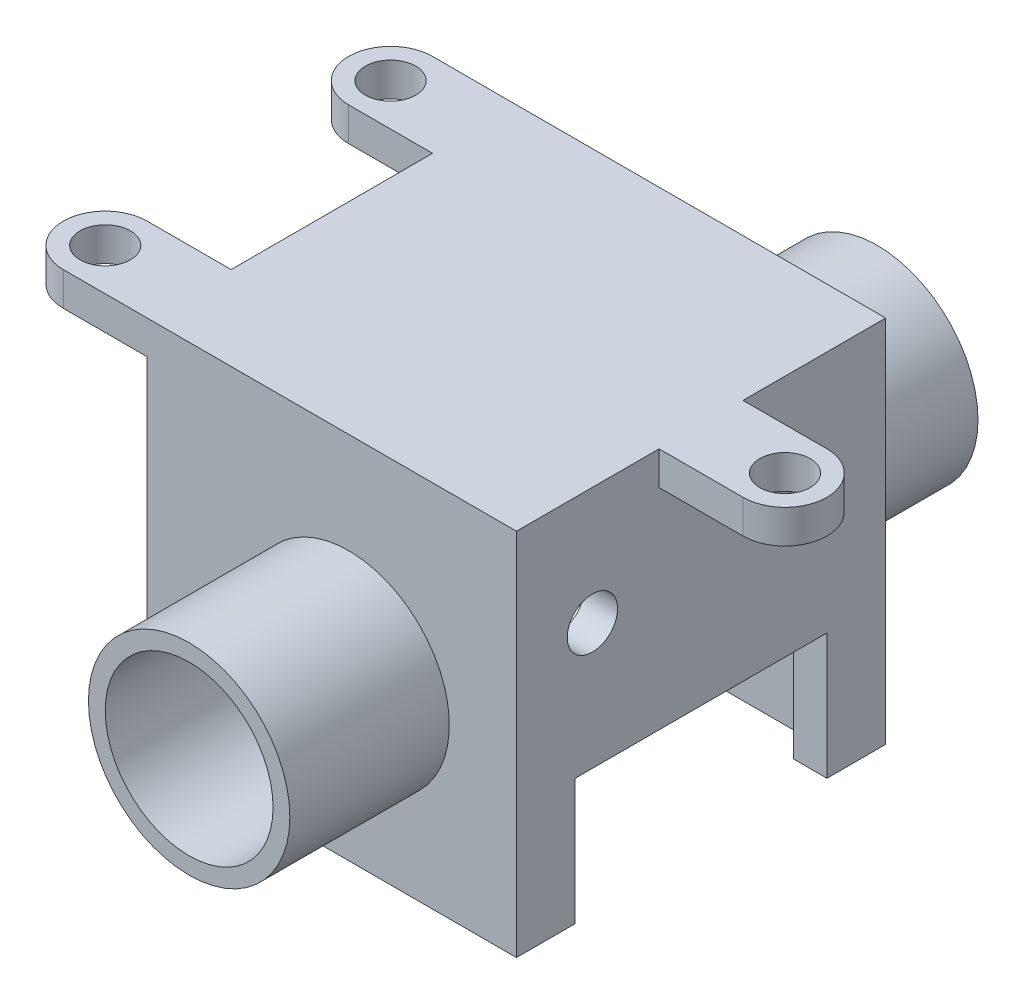
ISO-10303-21;
HEADER;
FILE_DESCRIPTION(('STEP AP214'),'2;1');
FILE_NAME('part.step','',(''),(''),'','','');
FILE_SCHEMA(('AUTOMOTIVE_DESIGN { 1 0 10303 214 1 1 1 1 }'));
ENDSEC;
DATA;
#1=APPLICATION_CONTEXT('core data for automotive mechanical design processes');
#2=APPLICATION_PROTOCOL_DEFINITION('international standard','automotive_design',2000,#1);
#3=PRODUCT_CONTEXT('',#1,'mechanical');
#4=PRODUCT('Part','Part','',(#3));
#5=PRODUCT_RELATED_PRODUCT_CATEGORY('part','',(#4));
#6=PRODUCT_DEFINITION_FORMATION('','',#4);
#7=PRODUCT_DEFINITION_CONTEXT('part definition',#1,'design');
#8=PRODUCT_DEFINITION('design','',#6,#7);
#9=PRODUCT_DEFINITION_SHAPE('','',#8);
#10=(LENGTH_UNIT() NAMED_UNIT(*) SI_UNIT(.MILLI.,.METRE.));
#11=(NAMED_UNIT(*) PLANE_ANGLE_UNIT() SI_UNIT($,.RADIAN.));
#12=(NAMED_UNIT(*) SI_UNIT($,.STERADIAN.) SOLID_ANGLE_UNIT());
#13=UNCERTAINTY_MEASURE_WITH_UNIT(LENGTH_MEASURE(1.E-05),#10,'distance_accuracy_value','');
#14=(GEOMETRIC_REPRESENTATION_CONTEXT(3) GLOBAL_UNCERTAINTY_ASSIGNED_CONTEXT((#13)) GLOBAL_UNIT_ASSIGNED_CONTEXT((#10,
#11,#12)) REPRESENTATION_CONTEXT('',''));
#15=CARTESIAN_POINT('',(0.,0.,0.));
#16=DIRECTION('',(0.,0.,1.));
#17=DIRECTION('',(1.,0.,0.));
#18=AXIS2_PLACEMENT_3D('',#15,#16,#17);
#19=CARTESIAN_POINT('',(-11.,10.,11.));
#20=DIRECTION('',(0.,0.,-1.));
#21=DIRECTION('',(-1.,0.,0.));
#22=AXIS2_PLACEMENT_3D('',#19,#20,#21);
#23=PLANE('',#22);
#24=DIRECTION('',(1.,0.,0.));
#25=VECTOR('',#24,1.);
#26=CARTESIAN_POINT('',(-11.,-10.,11.));
#27=LINE('',#26,#25);
#28=CARTESIAN_POINT('',(-11.,-10.,11.));
#29=VERTEX_POINT('',#28);
#30=CARTESIAN_POINT('',(11.,-10.,11.));
#31=VERTEX_POINT('',#30);
#32=EDGE_CURVE('E291',#29,#31,#27,.T.);
#33=ORIENTED_EDGE('',*,*,#32,.T.);
#34=DIRECTION('',(0.,-1.,0.));
#35=VECTOR('',#34,1.);
#36=CARTESIAN_POINT('',(11.,10.,11.));
#37=LINE('',#36,#35);
#38=CARTESIAN_POINT('',(11.,12.,11.));
#39=VERTEX_POINT('',#38);
#40=EDGE_CURVE('E293',#39,#31,#37,.T.);
#41=ORIENTED_EDGE('',*,*,#40,.F.);
#42=DIRECTION('',(1.,0.,0.));
#43=VECTOR('',#42,1.);
#44=CARTESIAN_POINT('',(-11.,12.,11.));
#45=LINE('',#44,#43);
#46=CARTESIAN_POINT('',(-16.,12.,11.));
#47=VERTEX_POINT('',#46);
#48=EDGE_CURVE('E374',#47,#39,#45,.T.);
#49=ORIENTED_EDGE('',*,*,#48,.F.);
#50=DIRECTION('',(0.,-1.,0.));
#51=VECTOR('',#50,1.);
#52=CARTESIAN_POINT('',(-16.,12.,11.));
#53=LINE('',#52,#51);
#54=CARTESIAN_POINT('',(-16.,10.,11.));
#55=VERTEX_POINT('',#54);
#56=EDGE_CURVE('E212',#47,#55,#53,.T.);
#57=ORIENTED_EDGE('',*,*,#56,.T.);
#58=DIRECTION('',(1.,0.,0.));
#59=VECTOR('',#58,1.);
#60=CARTESIAN_POINT('',(11.,10.,11.));
#61=LINE('',#60,#59);
#62=CARTESIAN_POINT('',(-11.,10.,11.));
#63=VERTEX_POINT('',#62);
#64=EDGE_CURVE('E401',#55,#63,#61,.T.);
#65=ORIENTED_EDGE('',*,*,#64,.T.);
#66=DIRECTION('',(0.,-1.,0.));
#67=VECTOR('',#66,1.);
#68=CARTESIAN_POINT('',(-11.,10.,11.));
#69=LINE('',#68,#67);
#70=EDGE_CURVE('E304',#63,#29,#69,.T.);
#71=ORIENTED_EDGE('',*,*,#70,.T.);
#72=EDGE_LOOP('',(#33,#41,#49,#57,#65,#71));
#73=FACE_BOUND('',#72,.T.);
#74=CARTESIAN_POINT('',(1.,0.,11.));
#75=DIRECTION('',(0.,0.,-1.));
#76=DIRECTION('',(-1.,0.,0.));
#77=AXIS2_PLACEMENT_3D('',#74,#75,#76);
#78=CIRCLE('',#77,6.);
#79=CARTESIAN_POINT('',(-5.,0.,11.));
#80=VERTEX_POINT('',#79);
#81=EDGE_CURVE('E11',#80,#80,#78,.F.);
#82=ORIENTED_EDGE('',*,*,#81,.F.);
#83=EDGE_LOOP('',(#82));
#84=FACE_BOUND('',#83,.T.);
#85=ADVANCED_FACE('F33',(#73,#84),#23,.F.);
#86=CARTESIAN_POINT('',(11.,10.,-11.));
#87=DIRECTION('',(-1.,0.,0.));
#88=DIRECTION('',(0.,0.,1.));
#89=AXIS2_PLACEMENT_3D('',#86,#87,#88);
#90=PLANE('',#89);
#91=CARTESIAN_POINT('',(11.,5.,6.475));
#92=DIRECTION('',(1.,0.,0.));
#93=DIRECTION('',(0.,0.,-1.));
#94=AXIS2_PLACEMENT_3D('',#91,#92,#93);
#95=CIRCLE('',#94,1.5);
#96=CARTESIAN_POINT('',(11.,5.,4.975));
#97=VERTEX_POINT('',#96);
#98=EDGE_CURVE('E236',#97,#97,#95,.T.);
#99=ORIENTED_EDGE('',*,*,#98,.F.);
#100=EDGE_LOOP('',(#99));
#101=FACE_BOUND('',#100,.T.);
#102=CARTESIAN_POINT('',(11.,5.,-6.475));
#103=DIRECTION('',(1.,0.,0.));
#104=DIRECTION('',(0.,0.,1.));
#105=AXIS2_PLACEMENT_3D('',#102,#103,#104);
#106=CIRCLE('',#105,1.5);
#107=CARTESIAN_POINT('',(11.,5.,-4.975));
#108=VERTEX_POINT('',#107);
#109=EDGE_CURVE('E253',#108,#108,#106,.T.);
#110=ORIENTED_EDGE('',*,*,#109,.F.);
#111=EDGE_LOOP('',(#110));
#112=FACE_BOUND('',#111,.T.);
#113=DIRECTION('',(0.,0.,-1.));
#114=VECTOR('',#113,1.);
#115=CARTESIAN_POINT('',(11.,-10.,-11.));
#116=LINE('',#115,#114);
#117=CARTESIAN_POINT('',(11.,-10.,7.5));
#118=VERTEX_POINT('',#117);
#119=EDGE_CURVE('E294',#31,#118,#116,.T.);
#120=ORIENTED_EDGE('',*,*,#119,.T.);
#121=DIRECTION('',(0.,-1.,0.));
#122=VECTOR('',#121,1.);
#123=CARTESIAN_POINT('',(11.,-10.,7.5));
#124=LINE('',#123,#122);
#125=CARTESIAN_POINT('',(11.,-2.5,7.5));
#126=VERTEX_POINT('',#125);
#127=EDGE_CURVE('E239',#126,#118,#124,.T.);
#128=ORIENTED_EDGE('',*,*,#127,.F.);
#129=DIRECTION('',(0.,0.,1.));
#130=VECTOR('',#129,1.);
#131=CARTESIAN_POINT('',(11.,-2.5,7.5));
#132=LINE('',#131,#130);
#133=CARTESIAN_POINT('',(11.,-2.5,-7.5));
#134=VERTEX_POINT('',#133);
#135=EDGE_CURVE('E235',#134,#126,#132,.T.);
#136=ORIENTED_EDGE('',*,*,#135,.F.);
#137=DIRECTION('',(0.,1.,0.));
#138=VECTOR('',#137,1.);
#139=CARTESIAN_POINT('',(11.,-10.,-7.5));
#140=LINE('',#139,#138);
#141=CARTESIAN_POINT('',(11.,-10.,-7.5));
#142=VERTEX_POINT('',#141);
#143=EDGE_CURVE('E232',#142,#134,#140,.T.);
#144=ORIENTED_EDGE('',*,*,#143,.F.);
#145=CARTESIAN_POINT('',(11.,-10.,-11.));
#146=VERTEX_POINT('',#145);
#147=EDGE_CURVE('E259',#142,#146,#116,.T.);
#148=ORIENTED_EDGE('',*,*,#147,.T.);
#149=DIRECTION('',(0.,-1.,0.));
#150=VECTOR('',#149,1.);
#151=CARTESIAN_POINT('',(11.,10.,-11.));
#152=LINE('',#151,#150);
#153=CARTESIAN_POINT('',(11.,12.,-11.));
#154=VERTEX_POINT('',#153);
#155=EDGE_CURVE('E310',#154,#146,#152,.T.);
#156=ORIENTED_EDGE('',*,*,#155,.F.);
#157=DIRECTION('',(0.,0.,-1.));
#158=VECTOR('',#157,1.);
#159=CARTESIAN_POINT('',(11.,12.,-11.));
#160=LINE('',#159,#158);
#161=CARTESIAN_POINT('',(11.,12.,-2.5));
#162=VERTEX_POINT('',#161);
#163=EDGE_CURVE('E386',#162,#154,#160,.T.);
#164=ORIENTED_EDGE('',*,*,#163,.F.);
#165=DIRECTION('',(0.,-1.,0.));
#166=VECTOR('',#165,1.);
#167=CARTESIAN_POINT('',(11.,12.,-2.5));
#168=LINE('',#167,#166);
#169=CARTESIAN_POINT('',(11.,10.,-2.5));
#170=VERTEX_POINT('',#169);
#171=EDGE_CURVE('E423',#162,#170,#168,.T.);
#172=ORIENTED_EDGE('',*,*,#171,.T.);
#173=DIRECTION('',(0.,0.,-1.));
#174=VECTOR('',#173,1.);
#175=CARTESIAN_POINT('',(11.,10.,-11.));
#176=LINE('',#175,#174);
#177=CARTESIAN_POINT('',(11.,10.,2.5));
#178=VERTEX_POINT('',#177);
#179=EDGE_CURVE('E289',#178,#170,#176,.T.);
#180=ORIENTED_EDGE('',*,*,#179,.F.);
#181=DIRECTION('',(0.,-1.,0.));
#182=VECTOR('',#181,1.);
#183=CARTESIAN_POINT('',(11.,12.,2.5));
#184=LINE('',#183,#182);
#185=CARTESIAN_POINT('',(11.,12.,2.5));
#186=VERTEX_POINT('',#185);
#187=EDGE_CURVE('E432',#186,#178,#184,.T.);
#188=ORIENTED_EDGE('',*,*,#187,.F.);
#189=DIRECTION('',(0.,0.,-1.));
#190=VECTOR('',#189,1.);
#191=CARTESIAN_POINT('',(11.,12.,2.5));
#192=LINE('',#191,#190);
#193=EDGE_CURVE('E368',#39,#186,#192,.T.);
#194=ORIENTED_EDGE('',*,*,#193,.F.);
#195=ORIENTED_EDGE('',*,*,#40,.T.);
#196=EDGE_LOOP('',(#120,#128,#136,#144,#148,#156,#164,#172,#180,#188,#194,#195));
#197=FACE_BOUND('',#196,.T.);
#198=ADVANCED_FACE('F35',(#101,#112,#197),#90,.F.);
#199=CARTESIAN_POINT('',(-11.,10.,-11.));
#200=DIRECTION('',(0.,0.,1.));
#201=DIRECTION('',(1.,0.,0.));
#202=AXIS2_PLACEMENT_3D('',#199,#200,#201);
#203=PLANE('',#202);
#204=CARTESIAN_POINT('',(1.,0.,-11.));
#205=DIRECTION('',(0.,0.,1.));
#206=DIRECTION('',(1.,0.,0.));
#207=AXIS2_PLACEMENT_3D('',#204,#205,#206);
#208=CIRCLE('',#207,6.);
#209=CARTESIAN_POINT('',(7.,0.,-11.));
#210=VERTEX_POINT('',#209);
#211=EDGE_CURVE('E37',#210,#210,#208,.T.);
#212=ORIENTED_EDGE('',*,*,#211,.T.);
#213=EDGE_LOOP('',(#212));
#214=FACE_BOUND('',#213,.T.);
#215=DIRECTION('',(-1.,0.,0.));
#216=VECTOR('',#215,1.);
#217=CARTESIAN_POINT('',(-11.,-10.,-11.));
#218=LINE('',#217,#216);
#219=CARTESIAN_POINT('',(-11.,-10.,-11.));
#220=VERTEX_POINT('',#219);
#221=EDGE_CURVE('E297',#146,#220,#218,.T.);
#222=ORIENTED_EDGE('',*,*,#221,.T.);
#223=DIRECTION('',(0.,-1.,0.));
#224=VECTOR('',#223,1.);
#225=CARTESIAN_POINT('',(-11.,10.,-11.));
#226=LINE('',#225,#224);
#227=CARTESIAN_POINT('',(-11.,10.,-11.));
#228=VERTEX_POINT('',#227);
#229=EDGE_CURVE('E307',#228,#220,#226,.T.);
#230=ORIENTED_EDGE('',*,*,#229,.F.);
#231=DIRECTION('',(-1.,0.,0.));
#232=VECTOR('',#231,1.);
#233=CARTESIAN_POINT('',(-11.,10.,-11.));
#234=LINE('',#233,#232);
#235=CARTESIAN_POINT('',(-16.,10.,-11.));
#236=VERTEX_POINT('',#235);
#237=EDGE_CURVE('E411',#228,#236,#234,.T.);
#238=ORIENTED_EDGE('',*,*,#237,.T.);
#239=DIRECTION('',(0.,-1.,0.));
#240=VECTOR('',#239,1.);
#241=CARTESIAN_POINT('',(-16.,12.,-11.));
#242=LINE('',#241,#240);
#243=CARTESIAN_POINT('',(-16.,12.,-11.));
#244=VERTEX_POINT('',#243);
#245=EDGE_CURVE('E420',#244,#236,#242,.T.);
#246=ORIENTED_EDGE('',*,*,#245,.F.);
#247=DIRECTION('',(-1.,0.,0.));
#248=VECTOR('',#247,1.);
#249=CARTESIAN_POINT('',(-11.,12.,-11.));
#250=LINE('',#249,#248);
#251=EDGE_CURVE('E389',#154,#244,#250,.T.);
#252=ORIENTED_EDGE('',*,*,#251,.F.);
#253=ORIENTED_EDGE('',*,*,#155,.T.);
#254=EDGE_LOOP('',(#222,#230,#238,#246,#252,#253));
#255=FACE_BOUND('',#254,.T.);
#256=ADVANCED_FACE('F461',(#214,#255),#203,.F.);
#257=CARTESIAN_POINT('',(-11.,10.,-11.));
#258=DIRECTION('',(1.,0.,0.));
#259=DIRECTION('',(0.,0.,-1.));
#260=AXIS2_PLACEMENT_3D('',#257,#258,#259);
#261=PLANE('',#260);
#262=CARTESIAN_POINT('',(-11.,0.,0.));
#263=DIRECTION('',(-1.,0.,0.));
#264=DIRECTION('',(0.,0.,1.));
#265=AXIS2_PLACEMENT_3D('',#262,#263,#264);
#266=CIRCLE('',#265,2.55);
#267=CARTESIAN_POINT('',(-11.,0.,2.55));
#268=VERTEX_POINT('',#267);
#269=EDGE_CURVE('E228',#268,#268,#266,.T.);
#270=ORIENTED_EDGE('',*,*,#269,.F.);
#271=EDGE_LOOP('',(#270));
#272=FACE_BOUND('',#271,.T.);
#273=DIRECTION('',(0.,0.,1.));
#274=VECTOR('',#273,1.);
#275=CARTESIAN_POINT('',(-11.,-10.,-11.));
#276=LINE('',#275,#274);
#277=EDGE_CURVE('E299',#220,#29,#276,.T.);
#278=ORIENTED_EDGE('',*,*,#277,.T.);
#279=ORIENTED_EDGE('',*,*,#70,.F.);
#280=DIRECTION('',(0.,0.,1.));
#281=VECTOR('',#280,1.);
#282=CARTESIAN_POINT('',(-11.,10.,-11.));
#283=LINE('',#282,#281);
#284=CARTESIAN_POINT('',(-11.,10.,5.99999999999999));
#285=VERTEX_POINT('',#284);
#286=EDGE_CURVE('E49',#285,#63,#283,.T.);
#287=ORIENTED_EDGE('',*,*,#286,.F.);
#288=DIRECTION('',(0.,-1.,0.));
#289=VECTOR('',#288,1.);
#290=CARTESIAN_POINT('',(-11.,12.,5.99999999999999));
#291=LINE('',#290,#289);
#292=CARTESIAN_POINT('',(-11.,12.,5.99999999999999));
#293=VERTEX_POINT('',#292);
#294=EDGE_CURVE('E189',#293,#285,#291,.T.);
#295=ORIENTED_EDGE('',*,*,#294,.F.);
#296=DIRECTION('',(0.,0.,1.));
#297=VECTOR('',#296,1.);
#298=CARTESIAN_POINT('',(-11.,12.,-5.99999999999999));
#299=LINE('',#298,#297);
#300=CARTESIAN_POINT('',(-11.,12.,-5.99999999999999));
#301=VERTEX_POINT('',#300);
#302=EDGE_CURVE('E195',#301,#293,#299,.T.);
#303=ORIENTED_EDGE('',*,*,#302,.F.);
#304=DIRECTION('',(0.,-1.,0.));
#305=VECTOR('',#304,1.);
#306=CARTESIAN_POINT('',(-11.,12.,-5.99999999999999));
#307=LINE('',#306,#305);
#308=CARTESIAN_POINT('',(-11.,10.,-5.99999999999999));
#309=VERTEX_POINT('',#308);
#310=EDGE_CURVE('E394',#301,#309,#307,.T.);
#311=ORIENTED_EDGE('',*,*,#310,.T.);
#312=EDGE_CURVE('E57',#228,#309,#283,.T.);
#313=ORIENTED_EDGE('',*,*,#312,.F.);
#314=ORIENTED_EDGE('',*,*,#229,.T.);
#315=EDGE_LOOP('',(#278,#279,#287,#295,#303,#311,#313,#314));
#316=FACE_BOUND('',#315,.T.);
#317=ADVANCED_FACE('F206',(#272,#316),#261,.F.);
#318=CARTESIAN_POINT('',(0.,-10.,0.));
#319=DIRECTION('',(0.,1.,0.));
#320=DIRECTION('',(0.,0.,1.));
#321=AXIS2_PLACEMENT_3D('',#318,#319,#320);
#322=PLANE('',#321);
#323=DIRECTION('',(0.,0.,-1.));
#324=VECTOR('',#323,1.);
#325=CARTESIAN_POINT('',(9.,-10.,-11.));
#326=LINE('',#325,#324);
#327=CARTESIAN_POINT('',(9.,-10.,9.));
#328=VERTEX_POINT('',#327);
#329=CARTESIAN_POINT('',(9.,-10.,7.5));
#330=VERTEX_POINT('',#329);
#331=EDGE_CURVE('E277',#328,#330,#326,.T.);
#332=ORIENTED_EDGE('',*,*,#331,.T.);
#333=DIRECTION('',(1.,0.,0.));
#334=VECTOR('',#333,1.);
#335=CARTESIAN_POINT('',(3.,-10.,7.5));
#336=LINE('',#335,#334);
#337=EDGE_CURVE('E242',#330,#118,#336,.T.);
#338=ORIENTED_EDGE('',*,*,#337,.T.);
#339=ORIENTED_EDGE('',*,*,#119,.F.);
#340=ORIENTED_EDGE('',*,*,#32,.F.);
#341=ORIENTED_EDGE('',*,*,#277,.F.);
#342=ORIENTED_EDGE('',*,*,#221,.F.);
#343=ORIENTED_EDGE('',*,*,#147,.F.);
#344=DIRECTION('',(1.,0.,0.));
#345=VECTOR('',#344,1.);
#346=CARTESIAN_POINT('',(3.,-10.,-7.5));
#347=LINE('',#346,#345);
#348=CARTESIAN_POINT('',(9.,-10.,-7.5));
#349=VERTEX_POINT('',#348);
#350=EDGE_CURVE('E241',#349,#142,#347,.T.);
#351=ORIENTED_EDGE('',*,*,#350,.F.);
#352=CARTESIAN_POINT('',(9.,-10.,-9.));
#353=VERTEX_POINT('',#352);
#354=EDGE_CURVE('E281',#349,#353,#326,.T.);
#355=ORIENTED_EDGE('',*,*,#354,.T.);
#356=DIRECTION('',(-1.,0.,0.));
#357=VECTOR('',#356,1.);
#358=CARTESIAN_POINT('',(-11.,-10.,-9.));
#359=LINE('',#358,#357);
#360=CARTESIAN_POINT('',(-9.,-10.,-9.));
#361=VERTEX_POINT('',#360);
#362=EDGE_CURVE('E280',#353,#361,#359,.T.);
#363=ORIENTED_EDGE('',*,*,#362,.T.);
#364=DIRECTION('',(0.,0.,1.));
#365=VECTOR('',#364,1.);
#366=CARTESIAN_POINT('',(-9.,-10.,-11.));
#367=LINE('',#366,#365);
#368=CARTESIAN_POINT('',(-9.,-10.,9.));
#369=VERTEX_POINT('',#368);
#370=EDGE_CURVE('E284',#361,#369,#367,.T.);
#371=ORIENTED_EDGE('',*,*,#370,.T.);
#372=DIRECTION('',(1.,0.,0.));
#373=VECTOR('',#372,1.);
#374=CARTESIAN_POINT('',(-11.,-10.,9.));
#375=LINE('',#374,#373);
#376=EDGE_CURVE('E265',#369,#328,#375,.T.);
#377=ORIENTED_EDGE('',*,*,#376,.T.);
#378=EDGE_LOOP('',(#332,#338,#339,#340,#341,#342,#343,#351,#355,#363,#371,#377));
#379=FACE_BOUND('',#378,.T.);
#380=ADVANCED_FACE('F344',(#379),#322,.F.);
#381=CARTESIAN_POINT('',(9.,10.,-11.));
#382=DIRECTION('',(-1.,0.,0.));
#383=DIRECTION('',(0.,0.,1.));
#384=AXIS2_PLACEMENT_3D('',#381,#382,#383);
#385=PLANE('',#384);
#386=DIRECTION('',(0.,1.,0.));
#387=VECTOR('',#386,1.);
#388=CARTESIAN_POINT('',(9.,10.,7.5));
#389=LINE('',#388,#387);
#390=CARTESIAN_POINT('',(9.,-2.5,7.5));
#391=VERTEX_POINT('',#390);
#392=EDGE_CURVE('E42',#330,#391,#389,.T.);
#393=ORIENTED_EDGE('',*,*,#392,.F.);
#394=ORIENTED_EDGE('',*,*,#331,.F.);
#395=DIRECTION('',(0.,-1.,0.));
#396=VECTOR('',#395,1.);
#397=CARTESIAN_POINT('',(9.,10.,9.));
#398=LINE('',#397,#396);
#399=CARTESIAN_POINT('',(9.,8.,9.));
#400=VERTEX_POINT('',#399);
#401=EDGE_CURVE('E266',#400,#328,#398,.T.);
#402=ORIENTED_EDGE('',*,*,#401,.F.);
#403=DIRECTION('',(0.,0.,-1.));
#404=VECTOR('',#403,1.);
#405=CARTESIAN_POINT('',(9.,8.,-11.));
#406=LINE('',#405,#404);
#407=CARTESIAN_POINT('',(9.,8.,-9.));
#408=VERTEX_POINT('',#407);
#409=EDGE_CURVE('E261',#400,#408,#406,.T.);
#410=ORIENTED_EDGE('',*,*,#409,.T.);
#411=DIRECTION('',(0.,-1.,0.));
#412=VECTOR('',#411,1.);
#413=CARTESIAN_POINT('',(9.,10.,-9.));
#414=LINE('',#413,#412);
#415=EDGE_CURVE('E256',#408,#353,#414,.T.);
#416=ORIENTED_EDGE('',*,*,#415,.T.);
#417=ORIENTED_EDGE('',*,*,#354,.F.);
#418=DIRECTION('',(0.,-1.,0.));
#419=VECTOR('',#418,1.);
#420=CARTESIAN_POINT('',(9.,10.,-7.5));
#421=LINE('',#420,#419);
#422=CARTESIAN_POINT('',(9.,-2.5,-7.5));
#423=VERTEX_POINT('',#422);
#424=EDGE_CURVE('E313',#423,#349,#421,.T.);
#425=ORIENTED_EDGE('',*,*,#424,.F.);
#426=DIRECTION('',(0.,0.,-1.));
#427=VECTOR('',#426,1.);
#428=CARTESIAN_POINT('',(9.,-2.5,-11.));
#429=LINE('',#428,#427);
#430=EDGE_CURVE('E320',#391,#423,#429,.T.);
#431=ORIENTED_EDGE('',*,*,#430,.F.);
#432=EDGE_LOOP('',(#393,#394,#402,#410,#416,#417,#425,#431));
#433=FACE_BOUND('',#432,.T.);
#434=CARTESIAN_POINT('',(9.,5.,6.475));
#435=DIRECTION('',(-1.,0.,0.));
#436=DIRECTION('',(0.,0.,1.));
#437=AXIS2_PLACEMENT_3D('',#434,#435,#436);
#438=CIRCLE('',#437,1.5);
#439=CARTESIAN_POINT('',(9.,5.,7.975));
#440=VERTEX_POINT('',#439);
#441=EDGE_CURVE('E316',#440,#440,#438,.T.);
#442=ORIENTED_EDGE('',*,*,#441,.F.);
#443=EDGE_LOOP('',(#442));
#444=FACE_BOUND('',#443,.T.);
#445=CARTESIAN_POINT('',(9.,5.,-6.475));
#446=DIRECTION('',(-1.,0.,0.));
#447=DIRECTION('',(0.,0.,1.));
#448=AXIS2_PLACEMENT_3D('',#445,#446,#447);
#449=CIRCLE('',#448,1.5);
#450=CARTESIAN_POINT('',(9.,5.,-4.975));
#451=VERTEX_POINT('',#450);
#452=EDGE_CURVE('E245',#451,#451,#449,.T.);
#453=ORIENTED_EDGE('',*,*,#452,.F.);
#454=EDGE_LOOP('',(#453));
#455=FACE_BOUND('',#454,.T.);
#456=ADVANCED_FACE('F356',(#433,#444,#455),#385,.T.);
#457=CARTESIAN_POINT('',(-11.,10.,-9.));
#458=DIRECTION('',(0.,0.,1.));
#459=DIRECTION('',(1.,0.,0.));
#460=AXIS2_PLACEMENT_3D('',#457,#458,#459);
#461=PLANE('',#460);
#462=CARTESIAN_POINT('',(1.,0.,-9.));
#463=DIRECTION('',(0.,0.,1.));
#464=DIRECTION('',(1.,0.,0.));
#465=AXIS2_PLACEMENT_3D('',#462,#463,#464);
#466=CIRCLE('',#465,5.);
#467=CARTESIAN_POINT('',(6.,0.,-9.));
#468=VERTEX_POINT('',#467);
#469=EDGE_CURVE('E225',#468,#468,#466,.T.);
#470=ORIENTED_EDGE('',*,*,#469,.F.);
#471=EDGE_LOOP('',(#470));
#472=FACE_BOUND('',#471,.T.);
#473=ORIENTED_EDGE('',*,*,#362,.F.);
#474=ORIENTED_EDGE('',*,*,#415,.F.);
#475=DIRECTION('',(-1.,0.,0.));
#476=VECTOR('',#475,1.);
#477=CARTESIAN_POINT('',(-11.,8.,-9.));
#478=LINE('',#477,#476);
#479=CARTESIAN_POINT('',(-9.,8.,-9.));
#480=VERTEX_POINT('',#479);
#481=EDGE_CURVE('E264',#408,#480,#478,.T.);
#482=ORIENTED_EDGE('',*,*,#481,.T.);
#483=DIRECTION('',(0.,-1.,0.));
#484=VECTOR('',#483,1.);
#485=CARTESIAN_POINT('',(-9.,10.,-9.));
#486=LINE('',#485,#484);
#487=EDGE_CURVE('E260',#480,#361,#486,.T.);
#488=ORIENTED_EDGE('',*,*,#487,.T.);
#489=EDGE_LOOP('',(#473,#474,#482,#488));
#490=FACE_BOUND('',#489,.T.);
#491=ADVANCED_FACE('F350',(#472,#490),#461,.T.);
#492=CARTESIAN_POINT('',(-9.,10.,-11.));
#493=DIRECTION('',(1.,0.,0.));
#494=DIRECTION('',(0.,0.,-1.));
#495=AXIS2_PLACEMENT_3D('',#492,#493,#494);
#496=PLANE('',#495);
#497=CARTESIAN_POINT('',(-9.,0.,0.));
#498=DIRECTION('',(1.,0.,0.));
#499=DIRECTION('',(0.,0.,-1.));
#500=AXIS2_PLACEMENT_3D('',#497,#498,#499);
#501=CIRCLE('',#500,2.55);
#502=CARTESIAN_POINT('',(-9.,0.,-2.55));
#503=VERTEX_POINT('',#502);
#504=EDGE_CURVE('E231',#503,#503,#501,.T.);
#505=ORIENTED_EDGE('',*,*,#504,.F.);
#506=EDGE_LOOP('',(#505));
#507=FACE_BOUND('',#506,.T.);
#508=ORIENTED_EDGE('',*,*,#370,.F.);
#509=ORIENTED_EDGE('',*,*,#487,.F.);
#510=DIRECTION('',(0.,0.,1.));
#511=VECTOR('',#510,1.);
#512=CARTESIAN_POINT('',(-9.,8.,-11.));
#513=LINE('',#512,#511);
#514=CARTESIAN_POINT('',(-9.,8.,9.));
#515=VERTEX_POINT('',#514);
#516=EDGE_CURVE('E273',#480,#515,#513,.T.);
#517=ORIENTED_EDGE('',*,*,#516,.T.);
#518=DIRECTION('',(0.,-1.,0.));
#519=VECTOR('',#518,1.);
#520=CARTESIAN_POINT('',(-9.,10.,9.));
#521=LINE('',#520,#519);
#522=EDGE_CURVE('E268',#515,#369,#521,.T.);
#523=ORIENTED_EDGE('',*,*,#522,.T.);
#524=EDGE_LOOP('',(#508,#509,#517,#523));
#525=FACE_BOUND('',#524,.T.);
#526=ADVANCED_FACE('F336',(#507,#525),#496,.T.);
#527=CARTESIAN_POINT('',(-11.,10.,9.));
#528=DIRECTION('',(0.,0.,-1.));
#529=DIRECTION('',(-1.,0.,0.));
#530=AXIS2_PLACEMENT_3D('',#527,#528,#529);
#531=PLANE('',#530);
#532=CARTESIAN_POINT('',(1.,0.,9.));
#533=DIRECTION('',(0.,0.,-1.));
#534=DIRECTION('',(-1.,0.,0.));
#535=AXIS2_PLACEMENT_3D('',#532,#533,#534);
#536=CIRCLE('',#535,5.);
#537=CARTESIAN_POINT('',(-4.,0.,9.));
#538=VERTEX_POINT('',#537);
#539=EDGE_CURVE('E224',#538,#538,#536,.T.);
#540=ORIENTED_EDGE('',*,*,#539,.F.);
#541=EDGE_LOOP('',(#540));
#542=FACE_BOUND('',#541,.T.);
#543=ORIENTED_EDGE('',*,*,#376,.F.);
#544=ORIENTED_EDGE('',*,*,#522,.F.);
#545=DIRECTION('',(1.,0.,0.));
#546=VECTOR('',#545,1.);
#547=CARTESIAN_POINT('',(-11.,8.,9.));
#548=LINE('',#547,#546);
#549=EDGE_CURVE('E269',#515,#400,#548,.T.);
#550=ORIENTED_EDGE('',*,*,#549,.T.);
#551=ORIENTED_EDGE('',*,*,#401,.T.);
#552=EDGE_LOOP('',(#543,#544,#550,#551));
#553=FACE_BOUND('',#552,.T.);
#554=ADVANCED_FACE('F332',(#542,#553),#531,.T.);
#555=CARTESIAN_POINT('',(0.,8.,0.));
#556=DIRECTION('',(0.,1.,0.));
#557=DIRECTION('',(0.,0.,1.));
#558=AXIS2_PLACEMENT_3D('',#555,#556,#557);
#559=PLANE('',#558);
#560=ORIENTED_EDGE('',*,*,#409,.F.);
#561=ORIENTED_EDGE('',*,*,#549,.F.);
#562=ORIENTED_EDGE('',*,*,#516,.F.);
#563=ORIENTED_EDGE('',*,*,#481,.F.);
#564=EDGE_LOOP('',(#560,#561,#562,#563));
#565=FACE_BOUND('',#564,.T.);
#566=ADVANCED_FACE('F335',(#565),#559,.F.);
#567=CARTESIAN_POINT('',(3.,5.,-6.475));
#568=DIRECTION('',(1.,0.,0.));
#569=DIRECTION('',(0.,0.,-1.));
#570=AXIS2_PLACEMENT_3D('',#567,#568,#569);
#571=CYLINDRICAL_SURFACE('',#570,1.5);
#572=ORIENTED_EDGE('',*,*,#452,.T.);
#573=EDGE_LOOP('',(#572));
#574=FACE_BOUND('',#573,.T.);
#575=ORIENTED_EDGE('',*,*,#109,.T.);
#576=EDGE_LOOP('',(#575));
#577=FACE_BOUND('',#576,.T.);
#578=ADVANCED_FACE('F505',(#574,#577),#571,.F.);
#579=CARTESIAN_POINT('',(3.,5.,6.475));
#580=DIRECTION('',(1.,0.,0.));
#581=DIRECTION('',(0.,0.,-1.));
#582=AXIS2_PLACEMENT_3D('',#579,#580,#581);
#583=CYLINDRICAL_SURFACE('',#582,1.5);
#584=ORIENTED_EDGE('',*,*,#441,.T.);
#585=EDGE_LOOP('',(#584));
#586=FACE_BOUND('',#585,.T.);
#587=ORIENTED_EDGE('',*,*,#98,.T.);
#588=EDGE_LOOP('',(#587));
#589=FACE_BOUND('',#588,.T.);
#590=ADVANCED_FACE('F498',(#586,#589),#583,.F.);
#591=CARTESIAN_POINT('',(3.,-10.,7.5));
#592=DIRECTION('',(0.,0.,1.));
#593=DIRECTION('',(1.,0.,0.));
#594=AXIS2_PLACEMENT_3D('',#591,#592,#593);
#595=PLANE('',#594);
#596=ORIENTED_EDGE('',*,*,#392,.T.);
#597=DIRECTION('',(1.,0.,0.));
#598=VECTOR('',#597,1.);
#599=CARTESIAN_POINT('',(3.,-2.5,7.5));
#600=LINE('',#599,#598);
#601=EDGE_CURVE('E246',#391,#126,#600,.T.);
#602=ORIENTED_EDGE('',*,*,#601,.T.);
#603=ORIENTED_EDGE('',*,*,#127,.T.);
#604=ORIENTED_EDGE('',*,*,#337,.F.);
#605=EDGE_LOOP('',(#596,#602,#603,#604));
#606=FACE_BOUND('',#605,.T.);
#607=ADVANCED_FACE('F496',(#606),#595,.F.);
#608=CARTESIAN_POINT('',(3.,-2.5,7.5));
#609=DIRECTION('',(0.,1.,0.));
#610=DIRECTION('',(0.,0.,1.));
#611=AXIS2_PLACEMENT_3D('',#608,#609,#610);
#612=PLANE('',#611);
#613=ORIENTED_EDGE('',*,*,#430,.T.);
#614=DIRECTION('',(1.,0.,0.));
#615=VECTOR('',#614,1.);
#616=CARTESIAN_POINT('',(3.,-2.5,-7.5));
#617=LINE('',#616,#615);
#618=EDGE_CURVE('E248',#423,#134,#617,.T.);
#619=ORIENTED_EDGE('',*,*,#618,.T.);
#620=ORIENTED_EDGE('',*,*,#135,.T.);
#621=ORIENTED_EDGE('',*,*,#601,.F.);
#622=EDGE_LOOP('',(#613,#619,#620,#621));
#623=FACE_BOUND('',#622,.T.);
#624=ADVANCED_FACE('F495',(#623),#612,.F.);
#625=CARTESIAN_POINT('',(3.,-10.,-7.5));
#626=DIRECTION('',(0.,0.,-1.));
#627=DIRECTION('',(0.,1.,0.));
#628=AXIS2_PLACEMENT_3D('',#625,#626,#627);
#629=PLANE('',#628);
#630=ORIENTED_EDGE('',*,*,#424,.T.);
#631=ORIENTED_EDGE('',*,*,#350,.T.);
#632=ORIENTED_EDGE('',*,*,#143,.T.);
#633=ORIENTED_EDGE('',*,*,#618,.F.);
#634=EDGE_LOOP('',(#630,#631,#632,#633));
#635=FACE_BOUND('',#634,.T.);
#636=ADVANCED_FACE('F492',(#635),#629,.F.);
#637=CARTESIAN_POINT('',(-3.,0.,0.));
#638=DIRECTION('',(-1.,0.,0.));
#639=DIRECTION('',(0.,0.,1.));
#640=AXIS2_PLACEMENT_3D('',#637,#638,#639);
#641=CYLINDRICAL_SURFACE('',#640,2.55);
#642=ORIENTED_EDGE('',*,*,#504,.T.);
#643=EDGE_LOOP('',(#642));
#644=FACE_BOUND('',#643,.T.);
#645=ORIENTED_EDGE('',*,*,#269,.T.);
#646=EDGE_LOOP('',(#645));
#647=FACE_BOUND('',#646,.T.);
#648=ADVANCED_FACE('F509',(#644,#647),#641,.F.);
#649=CARTESIAN_POINT('',(1.,0.,11.));
#650=DIRECTION('',(0.,0.,-1.));
#651=DIRECTION('',(-1.,0.,0.));
#652=AXIS2_PLACEMENT_3D('',#649,#650,#651);
#653=CYLINDRICAL_SURFACE('',#652,5.);
#654=ORIENTED_EDGE('',*,*,#539,.T.);
#655=EDGE_LOOP('',(#654));
#656=FACE_BOUND('',#655,.T.);
#657=CARTESIAN_POINT('',(1.,0.,20.5));
#658=DIRECTION('',(0.,0.,1.));
#659=DIRECTION('',(1.,0.,0.));
#660=AXIS2_PLACEMENT_3D('',#657,#658,#659);
#661=CIRCLE('',#660,5.);
#662=CARTESIAN_POINT('',(6.,0.,20.5));
#663=VERTEX_POINT('',#662);
#664=EDGE_CURVE('E218',#663,#663,#661,.T.);
#665=ORIENTED_EDGE('',*,*,#664,.T.);
#666=EDGE_LOOP('',(#665));
#667=FACE_BOUND('',#666,.T.);
#668=ADVANCED_FACE('F329',(#656,#667),#653,.F.);
#669=ORIENTED_EDGE('',*,*,#469,.T.);
#670=EDGE_LOOP('',(#669));
#671=FACE_BOUND('',#670,.T.);
#672=CARTESIAN_POINT('',(1.,0.,-20.5));
#673=DIRECTION('',(0.,0.,1.));
#674=DIRECTION('',(1.,0.,0.));
#675=AXIS2_PLACEMENT_3D('',#672,#673,#674);
#676=CIRCLE('',#675,5.);
#677=CARTESIAN_POINT('',(6.,0.,-20.5));
#678=VERTEX_POINT('',#677);
#679=EDGE_CURVE('E207',#678,#678,#676,.T.);
#680=ORIENTED_EDGE('',*,*,#679,.F.);
#681=EDGE_LOOP('',(#680));
#682=FACE_BOUND('',#681,.T.);
#683=ADVANCED_FACE('F590',(#671,#682),#653,.F.);
#684=CARTESIAN_POINT('',(1.,0.,20.5));
#685=DIRECTION('',(0.,0.,-1.));
#686=DIRECTION('',(-1.,0.,0.));
#687=AXIS2_PLACEMENT_3D('',#684,#685,#686);
#688=CYLINDRICAL_SURFACE('',#687,6.);
#689=CARTESIAN_POINT('',(1.,0.,20.5));
#690=DIRECTION('',(0.,0.,1.));
#691=DIRECTION('',(1.,0.,0.));
#692=AXIS2_PLACEMENT_3D('',#689,#690,#691);
#693=CIRCLE('',#692,6.);
#694=CARTESIAN_POINT('',(7.,0.,20.5));
#695=VERTEX_POINT('',#694);
#696=EDGE_CURVE('E221',#695,#695,#693,.T.);
#697=ORIENTED_EDGE('',*,*,#696,.F.);
#698=EDGE_LOOP('',(#697));
#699=FACE_BOUND('',#698,.T.);
#700=ORIENTED_EDGE('',*,*,#81,.T.);
#701=EDGE_LOOP('',(#700));
#702=FACE_BOUND('',#701,.T.);
#703=ADVANCED_FACE('F597',(#699,#702),#688,.T.);
#704=CARTESIAN_POINT('',(1.,0.,20.5));
#705=DIRECTION('',(0.,0.,1.));
#706=DIRECTION('',(1.,0.,0.));
#707=AXIS2_PLACEMENT_3D('',#704,#705,#706);
#708=PLANE('',#707);
#709=ORIENTED_EDGE('',*,*,#696,.T.);
#710=EDGE_LOOP('',(#709));
#711=FACE_BOUND('',#710,.T.);
#712=ORIENTED_EDGE('',*,*,#664,.F.);
#713=EDGE_LOOP('',(#712));
#714=FACE_BOUND('',#713,.T.);
#715=ADVANCED_FACE('F601',(#711,#714),#708,.T.);
#716=CARTESIAN_POINT('',(1.,0.,-20.5));
#717=DIRECTION('',(0.,0.,1.));
#718=DIRECTION('',(1.,0.,0.));
#719=AXIS2_PLACEMENT_3D('',#716,#717,#718);
#720=CYLINDRICAL_SURFACE('',#719,6.);
#721=CARTESIAN_POINT('',(1.,0.,-20.5));
#722=DIRECTION('',(0.,0.,1.));
#723=DIRECTION('',(1.,0.,0.));
#724=AXIS2_PLACEMENT_3D('',#721,#722,#723);
#725=CIRCLE('',#724,6.);
#726=CARTESIAN_POINT('',(7.,0.,-20.5));
#727=VERTEX_POINT('',#726);
#728=EDGE_CURVE('E210',#727,#727,#725,.T.);
#729=ORIENTED_EDGE('',*,*,#728,.T.);
#730=EDGE_LOOP('',(#729));
#731=FACE_BOUND('',#730,.T.);
#732=ORIENTED_EDGE('',*,*,#211,.F.);
#733=EDGE_LOOP('',(#732));
#734=FACE_BOUND('',#733,.T.);
#735=ADVANCED_FACE('F611',(#731,#734),#720,.T.);
#736=CARTESIAN_POINT('',(1.,0.,-20.5));
#737=DIRECTION('',(0.,0.,-1.));
#738=DIRECTION('',(1.,0.,0.));
#739=AXIS2_PLACEMENT_3D('',#736,#737,#738);
#740=PLANE('',#739);
#741=ORIENTED_EDGE('',*,*,#679,.T.);
#742=EDGE_LOOP('',(#741));
#743=FACE_BOUND('',#742,.T.);
#744=ORIENTED_EDGE('',*,*,#728,.F.);
#745=EDGE_LOOP('',(#744));
#746=FACE_BOUND('',#745,.T.);
#747=ADVANCED_FACE('F454',(#743,#746),#740,.T.);
#748=CARTESIAN_POINT('',(-16.,10.,8.49999999999999));
#749=DIRECTION('',(0.,1.,0.));
#750=DIRECTION('',(0.,0.,1.));
#751=AXIS2_PLACEMENT_3D('',#748,#749,#750);
#752=PLANE('',#751);
#753=CARTESIAN_POINT('',(16.,10.,0.));
#754=DIRECTION('',(0.,1.,0.));
#755=DIRECTION('',(0.,0.,1.));
#756=AXIS2_PLACEMENT_3D('',#753,#754,#755);
#757=CIRCLE('',#756,1.5);
#758=CARTESIAN_POINT('',(16.,10.,1.5));
#759=VERTEX_POINT('',#758);
#760=EDGE_CURVE('E796',#759,#759,#757,.T.);
#761=ORIENTED_EDGE('',*,*,#760,.T.);
#762=EDGE_LOOP('',(#761));
#763=FACE_BOUND('',#762,.T.);
#764=DIRECTION('',(1.,0.,0.));
#765=VECTOR('',#764,1.);
#766=CARTESIAN_POINT('',(11.,10.,2.5));
#767=LINE('',#766,#765);
#768=CARTESIAN_POINT('',(16.,10.,2.5));
#769=VERTEX_POINT('',#768);
#770=EDGE_CURVE('E404',#178,#769,#767,.T.);
#771=ORIENTED_EDGE('',*,*,#770,.F.);
#772=ORIENTED_EDGE('',*,*,#179,.T.);
#773=DIRECTION('',(-1.,0.,0.));
#774=VECTOR('',#773,1.);
#775=CARTESIAN_POINT('',(11.,10.,-2.5));
#776=LINE('',#775,#774);
#777=CARTESIAN_POINT('',(16.,10.,-2.5));
#778=VERTEX_POINT('',#777);
#779=EDGE_CURVE('E408',#778,#170,#776,.T.);
#780=ORIENTED_EDGE('',*,*,#779,.F.);
#781=CARTESIAN_POINT('',(16.,10.,0.));
#782=DIRECTION('',(0.,1.,0.));
#783=DIRECTION('',(0.,0.,-1.));
#784=AXIS2_PLACEMENT_3D('',#781,#782,#783);
#785=CIRCLE('',#784,2.5);
#786=EDGE_CURVE('E406',#769,#778,#785,.T.);
#787=ORIENTED_EDGE('',*,*,#786,.F.);
#788=EDGE_LOOP('',(#771,#772,#780,#787));
#789=FACE_BOUND('',#788,.T.);
#790=ADVANCED_FACE('F443',(#763,#789),#752,.F.);
#791=CARTESIAN_POINT('',(-16.,10.,-8.49999999999999));
#792=DIRECTION('',(0.,1.,0.));
#793=DIRECTION('',(0.,0.,-1.));
#794=AXIS2_PLACEMENT_3D('',#791,#792,#793);
#795=CIRCLE('',#794,1.5);
#796=CARTESIAN_POINT('',(-16.,10.,-9.99999999999999));
#797=VERTEX_POINT('',#796);
#798=EDGE_CURVE('E798',#797,#797,#795,.T.);
#799=ORIENTED_EDGE('',*,*,#798,.T.);
#800=EDGE_LOOP('',(#799));
#801=FACE_BOUND('',#800,.T.);
#802=ORIENTED_EDGE('',*,*,#237,.F.);
#803=ORIENTED_EDGE('',*,*,#312,.T.);
#804=DIRECTION('',(1.,0.,0.));
#805=VECTOR('',#804,1.);
#806=CARTESIAN_POINT('',(-11.,10.,-5.99999999999999));
#807=LINE('',#806,#805);
#808=CARTESIAN_POINT('',(-16.,10.,-5.99999999999999));
#809=VERTEX_POINT('',#808);
#810=EDGE_CURVE('E204',#809,#309,#807,.T.);
#811=ORIENTED_EDGE('',*,*,#810,.F.);
#812=CARTESIAN_POINT('',(-16.,10.,-8.49999999999999));
#813=DIRECTION('',(0.,1.,0.));
#814=DIRECTION('',(0.,0.,-1.));
#815=AXIS2_PLACEMENT_3D('',#812,#813,#814);
#816=CIRCLE('',#815,2.5);
#817=EDGE_CURVE('E413',#236,#809,#816,.T.);
#818=ORIENTED_EDGE('',*,*,#817,.F.);
#819=EDGE_LOOP('',(#802,#803,#811,#818));
#820=FACE_BOUND('',#819,.T.);
#821=ADVANCED_FACE('F440',(#801,#820),#752,.F.);
#822=CARTESIAN_POINT('',(-16.,10.,8.49999999999999));
#823=DIRECTION('',(0.,1.,0.));
#824=DIRECTION('',(0.,0.,1.));
#825=AXIS2_PLACEMENT_3D('',#822,#823,#824);
#826=CIRCLE('',#825,1.5);
#827=CARTESIAN_POINT('',(-16.,10.,9.99999999999999));
#828=VERTEX_POINT('',#827);
#829=EDGE_CURVE('E804',#828,#828,#826,.T.);
#830=ORIENTED_EDGE('',*,*,#829,.T.);
#831=EDGE_LOOP('',(#830));
#832=FACE_BOUND('',#831,.T.);
#833=DIRECTION('',(-1.,0.,0.));
#834=VECTOR('',#833,1.);
#835=CARTESIAN_POINT('',(-11.,10.,5.99999999999999));
#836=LINE('',#835,#834);
#837=CARTESIAN_POINT('',(-16.,10.,5.99999999999999));
#838=VERTEX_POINT('',#837);
#839=EDGE_CURVE('E395',#285,#838,#836,.T.);
#840=ORIENTED_EDGE('',*,*,#839,.F.);
#841=ORIENTED_EDGE('',*,*,#286,.T.);
#842=ORIENTED_EDGE('',*,*,#64,.F.);
#843=CARTESIAN_POINT('',(-16.,10.,8.49999999999999));
#844=DIRECTION('',(0.,1.,0.));
#845=DIRECTION('',(0.,0.,1.));
#846=AXIS2_PLACEMENT_3D('',#843,#844,#845);
#847=CIRCLE('',#846,2.5);
#848=EDGE_CURVE('E397',#838,#55,#847,.T.);
#849=ORIENTED_EDGE('',*,*,#848,.F.);
#850=EDGE_LOOP('',(#840,#841,#842,#849));
#851=FACE_BOUND('',#850,.T.);
#852=ADVANCED_FACE('F438',(#832,#851),#752,.F.);
#853=CARTESIAN_POINT('',(-16.,12.,8.49999999999999));
#854=DIRECTION('',(0.,1.,0.));
#855=DIRECTION('',(0.,0.,1.));
#856=AXIS2_PLACEMENT_3D('',#853,#854,#855);
#857=PLANE('',#856);
#858=CARTESIAN_POINT('',(-16.,12.,-8.49999999999999));
#859=DIRECTION('',(0.,1.,0.));
#860=DIRECTION('',(0.,0.,-1.));
#861=AXIS2_PLACEMENT_3D('',#858,#859,#860);
#862=CIRCLE('',#861,1.5);
#863=CARTESIAN_POINT('',(-16.,12.,-9.99999999999999));
#864=VERTEX_POINT('',#863);
#865=EDGE_CURVE('E801',#864,#864,#862,.T.);
#866=ORIENTED_EDGE('',*,*,#865,.F.);
#867=EDGE_LOOP('',(#866));
#868=FACE_BOUND('',#867,.T.);
#869=ORIENTED_EDGE('',*,*,#302,.T.);
#870=DIRECTION('',(-1.,0.,0.));
#871=VECTOR('',#870,1.);
#872=CARTESIAN_POINT('',(-11.,12.,5.99999999999999));
#873=LINE('',#872,#871);
#874=CARTESIAN_POINT('',(-16.,12.,5.99999999999999));
#875=VERTEX_POINT('',#874);
#876=EDGE_CURVE('E186',#293,#875,#873,.T.);
#877=ORIENTED_EDGE('',*,*,#876,.T.);
#878=CARTESIAN_POINT('',(-16.,12.,8.49999999999999));
#879=DIRECTION('',(0.,1.,0.));
#880=DIRECTION('',(0.,0.,1.));
#881=AXIS2_PLACEMENT_3D('',#878,#879,#880);
#882=CIRCLE('',#881,2.5);
#883=EDGE_CURVE('E194',#875,#47,#882,.T.);
#884=ORIENTED_EDGE('',*,*,#883,.T.);
#885=ORIENTED_EDGE('',*,*,#48,.T.);
#886=ORIENTED_EDGE('',*,*,#193,.T.);
#887=DIRECTION('',(1.,0.,0.));
#888=VECTOR('',#887,1.);
#889=CARTESIAN_POINT('',(11.,12.,2.5));
#890=LINE('',#889,#888);
#891=CARTESIAN_POINT('',(16.,12.,2.5));
#892=VERTEX_POINT('',#891);
#893=EDGE_CURVE('E377',#186,#892,#890,.T.);
#894=ORIENTED_EDGE('',*,*,#893,.T.);
#895=CARTESIAN_POINT('',(16.,12.,0.));
#896=DIRECTION('',(0.,1.,0.));
#897=DIRECTION('',(0.,0.,-1.));
#898=AXIS2_PLACEMENT_3D('',#895,#896,#897);
#899=CIRCLE('',#898,2.5);
#900=CARTESIAN_POINT('',(16.,12.,-2.5));
#901=VERTEX_POINT('',#900);
#902=EDGE_CURVE('E382',#892,#901,#899,.T.);
#903=ORIENTED_EDGE('',*,*,#902,.T.);
#904=DIRECTION('',(-1.,0.,0.));
#905=VECTOR('',#904,1.);
#906=CARTESIAN_POINT('',(11.,12.,-2.5));
#907=LINE('',#906,#905);
#908=EDGE_CURVE('E384',#901,#162,#907,.T.);
#909=ORIENTED_EDGE('',*,*,#908,.T.);
#910=ORIENTED_EDGE('',*,*,#163,.T.);
#911=ORIENTED_EDGE('',*,*,#251,.T.);
#912=CARTESIAN_POINT('',(-16.,12.,-8.49999999999999));
#913=DIRECTION('',(0.,1.,0.));
#914=DIRECTION('',(0.,0.,-1.));
#915=AXIS2_PLACEMENT_3D('',#912,#913,#914);
#916=CIRCLE('',#915,2.5);
#917=CARTESIAN_POINT('',(-16.,12.,-5.99999999999999));
#918=VERTEX_POINT('',#917);
#919=EDGE_CURVE('E391',#244,#918,#916,.T.);
#920=ORIENTED_EDGE('',*,*,#919,.T.);
#921=DIRECTION('',(1.,0.,0.));
#922=VECTOR('',#921,1.);
#923=CARTESIAN_POINT('',(-11.,12.,-5.99999999999999));
#924=LINE('',#923,#922);
#925=EDGE_CURVE('E201',#918,#301,#924,.T.);
#926=ORIENTED_EDGE('',*,*,#925,.T.);
#927=EDGE_LOOP('',(#869,#877,#884,#885,#886,#894,#903,#909,#910,#911,#920,#926));
#928=FACE_BOUND('',#927,.T.);
#929=CARTESIAN_POINT('',(-16.,12.,8.49999999999999));
#930=DIRECTION('',(0.,1.,0.));
#931=DIRECTION('',(0.,0.,1.));
#932=AXIS2_PLACEMENT_3D('',#929,#930,#931);
#933=CIRCLE('',#932,1.5);
#934=CARTESIAN_POINT('',(-16.,12.,9.99999999999999));
#935=VERTEX_POINT('',#934);
#936=EDGE_CURVE('E398',#935,#935,#933,.T.);
#937=ORIENTED_EDGE('',*,*,#936,.F.);
#938=EDGE_LOOP('',(#937));
#939=FACE_BOUND('',#938,.T.);
#940=CARTESIAN_POINT('',(16.,12.,0.));
#941=DIRECTION('',(0.,1.,0.));
#942=DIRECTION('',(0.,0.,1.));
#943=AXIS2_PLACEMENT_3D('',#940,#941,#942);
#944=CIRCLE('',#943,1.5);
#945=CARTESIAN_POINT('',(16.,12.,1.5));
#946=VERTEX_POINT('',#945);
#947=EDGE_CURVE('E793',#946,#946,#944,.T.);
#948=ORIENTED_EDGE('',*,*,#947,.F.);
#949=EDGE_LOOP('',(#948));
#950=FACE_BOUND('',#949,.T.);
#951=ADVANCED_FACE('F198',(#868,#928,#939,#950),#857,.T.);
#952=CARTESIAN_POINT('',(-11.,12.,5.99999999999999));
#953=DIRECTION('',(0.,0.,1.));
#954=DIRECTION('',(1.,0.,0.));
#955=AXIS2_PLACEMENT_3D('',#952,#953,#954);
#956=PLANE('',#955);
#957=ORIENTED_EDGE('',*,*,#839,.T.);
#958=DIRECTION('',(0.,-1.,0.));
#959=VECTOR('',#958,1.);
#960=CARTESIAN_POINT('',(-16.,12.,5.99999999999999));
#961=LINE('',#960,#959);
#962=EDGE_CURVE('E191',#875,#838,#961,.T.);
#963=ORIENTED_EDGE('',*,*,#962,.F.);
#964=ORIENTED_EDGE('',*,*,#876,.F.);
#965=ORIENTED_EDGE('',*,*,#294,.T.);
#966=EDGE_LOOP('',(#957,#963,#964,#965));
#967=FACE_BOUND('',#966,.T.);
#968=ADVANCED_FACE('F188',(#967),#956,.F.);
#969=CARTESIAN_POINT('',(-16.,12.,8.49999999999999));
#970=DIRECTION('',(0.,-1.,0.));
#971=DIRECTION('',(0.,0.,-1.));
#972=AXIS2_PLACEMENT_3D('',#969,#970,#971);
#973=CYLINDRICAL_SURFACE('',#972,2.5);
#974=ORIENTED_EDGE('',*,*,#848,.T.);
#975=ORIENTED_EDGE('',*,*,#56,.F.);
#976=ORIENTED_EDGE('',*,*,#883,.F.);
#977=ORIENTED_EDGE('',*,*,#962,.T.);
#978=EDGE_LOOP('',(#974,#975,#976,#977));
#979=FACE_BOUND('',#978,.T.);
#980=ADVANCED_FACE('F435',(#979),#973,.T.);
#981=CARTESIAN_POINT('',(11.,12.,2.5));
#982=DIRECTION('',(0.,0.,-1.));
#983=DIRECTION('',(-1.,0.,0.));
#984=AXIS2_PLACEMENT_3D('',#981,#982,#983);
#985=PLANE('',#984);
#986=ORIENTED_EDGE('',*,*,#770,.T.);
#987=DIRECTION('',(0.,-1.,0.));
#988=VECTOR('',#987,1.);
#989=CARTESIAN_POINT('',(16.,12.,2.5));
#990=LINE('',#989,#988);
#991=EDGE_CURVE('E429',#892,#769,#990,.T.);
#992=ORIENTED_EDGE('',*,*,#991,.F.);
#993=ORIENTED_EDGE('',*,*,#893,.F.);
#994=ORIENTED_EDGE('',*,*,#187,.T.);
#995=EDGE_LOOP('',(#986,#992,#993,#994));
#996=FACE_BOUND('',#995,.T.);
#997=ADVANCED_FACE('F710',(#996),#985,.F.);
#998=CARTESIAN_POINT('',(16.,12.,0.));
#999=DIRECTION('',(0.,-1.,0.));
#1000=DIRECTION('',(0.,0.,-1.));
#1001=AXIS2_PLACEMENT_3D('',#998,#999,#1000);
#1002=CYLINDRICAL_SURFACE('',#1001,2.5);
#1003=ORIENTED_EDGE('',*,*,#786,.T.);
#1004=DIRECTION('',(0.,-1.,0.));
#1005=VECTOR('',#1004,1.);
#1006=CARTESIAN_POINT('',(16.,12.,-2.5));
#1007=LINE('',#1006,#1005);
#1008=EDGE_CURVE('E426',#901,#778,#1007,.T.);
#1009=ORIENTED_EDGE('',*,*,#1008,.F.);
#1010=ORIENTED_EDGE('',*,*,#902,.F.);
#1011=ORIENTED_EDGE('',*,*,#991,.T.);
#1012=EDGE_LOOP('',(#1003,#1009,#1010,#1011));
#1013=FACE_BOUND('',#1012,.T.);
#1014=ADVANCED_FACE('F719',(#1013),#1002,.T.);
#1015=CARTESIAN_POINT('',(11.,12.,-2.5));
#1016=DIRECTION('',(0.,0.,1.));
#1017=DIRECTION('',(1.,0.,0.));
#1018=AXIS2_PLACEMENT_3D('',#1015,#1016,#1017);
#1019=PLANE('',#1018);
#1020=ORIENTED_EDGE('',*,*,#779,.T.);
#1021=ORIENTED_EDGE('',*,*,#171,.F.);
#1022=ORIENTED_EDGE('',*,*,#908,.F.);
#1023=ORIENTED_EDGE('',*,*,#1008,.T.);
#1024=EDGE_LOOP('',(#1020,#1021,#1022,#1023));
#1025=FACE_BOUND('',#1024,.T.);
#1026=ADVANCED_FACE('F729',(#1025),#1019,.F.);
#1027=CARTESIAN_POINT('',(-16.,12.,-8.49999999999999));
#1028=DIRECTION('',(0.,-1.,0.));
#1029=DIRECTION('',(0.,0.,-1.));
#1030=AXIS2_PLACEMENT_3D('',#1027,#1028,#1029);
#1031=CYLINDRICAL_SURFACE('',#1030,2.5);
#1032=ORIENTED_EDGE('',*,*,#817,.T.);
#1033=DIRECTION('',(0.,-1.,0.));
#1034=VECTOR('',#1033,1.);
#1035=CARTESIAN_POINT('',(-16.,12.,-5.99999999999999));
#1036=LINE('',#1035,#1034);
#1037=EDGE_CURVE('E417',#918,#809,#1036,.T.);
#1038=ORIENTED_EDGE('',*,*,#1037,.F.);
#1039=ORIENTED_EDGE('',*,*,#919,.F.);
#1040=ORIENTED_EDGE('',*,*,#245,.T.);
#1041=EDGE_LOOP('',(#1032,#1038,#1039,#1040));
#1042=FACE_BOUND('',#1041,.T.);
#1043=ADVANCED_FACE('F483',(#1042),#1031,.T.);
#1044=CARTESIAN_POINT('',(-11.,12.,-5.99999999999999));
#1045=DIRECTION('',(0.,0.,-1.));
#1046=DIRECTION('',(-1.,0.,0.));
#1047=AXIS2_PLACEMENT_3D('',#1044,#1045,#1046);
#1048=PLANE('',#1047);
#1049=ORIENTED_EDGE('',*,*,#810,.T.);
#1050=ORIENTED_EDGE('',*,*,#310,.F.);
#1051=ORIENTED_EDGE('',*,*,#925,.F.);
#1052=ORIENTED_EDGE('',*,*,#1037,.T.);
#1053=EDGE_LOOP('',(#1049,#1050,#1051,#1052));
#1054=FACE_BOUND('',#1053,.T.);
#1055=ADVANCED_FACE('F748',(#1054),#1048,.F.);
#1056=CARTESIAN_POINT('',(-16.,12.,8.49999999999999));
#1057=DIRECTION('',(0.,-1.,0.));
#1058=DIRECTION('',(0.,0.,-1.));
#1059=AXIS2_PLACEMENT_3D('',#1056,#1057,#1058);
#1060=CYLINDRICAL_SURFACE('',#1059,1.5);
#1061=ORIENTED_EDGE('',*,*,#936,.T.);
#1062=EDGE_LOOP('',(#1061));
#1063=FACE_BOUND('',#1062,.T.);
#1064=ORIENTED_EDGE('',*,*,#829,.F.);
#1065=EDGE_LOOP('',(#1064));
#1066=FACE_BOUND('',#1065,.T.);
#1067=ADVANCED_FACE('F757',(#1063,#1066),#1060,.F.);
#1068=CARTESIAN_POINT('',(-16.,12.,-8.49999999999999));
#1069=DIRECTION('',(0.,-1.,0.));
#1070=DIRECTION('',(0.,0.,-1.));
#1071=AXIS2_PLACEMENT_3D('',#1068,#1069,#1070);
#1072=CYLINDRICAL_SURFACE('',#1071,1.5);
#1073=ORIENTED_EDGE('',*,*,#865,.T.);
#1074=EDGE_LOOP('',(#1073));
#1075=FACE_BOUND('',#1074,.T.);
#1076=ORIENTED_EDGE('',*,*,#798,.F.);
#1077=EDGE_LOOP('',(#1076));
#1078=FACE_BOUND('',#1077,.T.);
#1079=ADVANCED_FACE('F766',(#1075,#1078),#1072,.F.);
#1080=CARTESIAN_POINT('',(16.,12.,0.));
#1081=DIRECTION('',(0.,-1.,0.));
#1082=DIRECTION('',(0.,0.,-1.));
#1083=AXIS2_PLACEMENT_3D('',#1080,#1081,#1082);
#1084=CYLINDRICAL_SURFACE('',#1083,1.5);
#1085=ORIENTED_EDGE('',*,*,#947,.T.);
#1086=EDGE_LOOP('',(#1085));
#1087=FACE_BOUND('',#1086,.T.);
#1088=ORIENTED_EDGE('',*,*,#760,.F.);
#1089=EDGE_LOOP('',(#1088));
#1090=FACE_BOUND('',#1089,.T.);
#1091=ADVANCED_FACE('F776',(#1087,#1090),#1084,.F.);
#1092=CLOSED_SHELL('',(#85,#198,#256,#317,#380,#456,#491,#526,#554,#566,#578,#590,#607,#624,
#636,#648,#668,#683,#703,#715,#735,#747,#790,#821,#852,#951,#968,#980,#997,#1014,#1026,#1043,
#1055,#1067,#1079,#1091));
#1093=MANIFOLD_SOLID_BREP('B2',#1092);
#1094=ADVANCED_BREP_SHAPE_REPRESENTATION('',(#18,#1093),#14);
#1095=SHAPE_DEFINITION_REPRESENTATION(#9,#1094);
ENDSEC;
END-ISO-10303-21;
